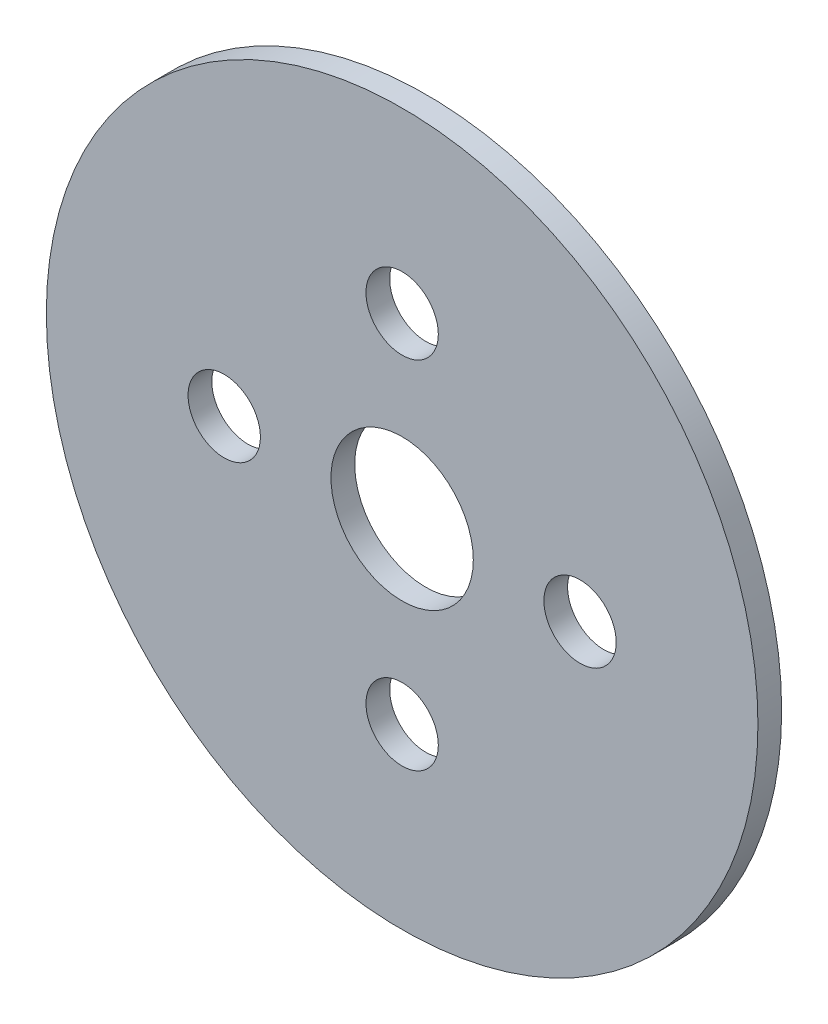
ISO-10303-21;
HEADER;
FILE_DESCRIPTION(('STEP AP214'),'2;1');
FILE_NAME('part.step','',(''),(''),'','','');
FILE_SCHEMA(('AUTOMOTIVE_DESIGN { 1 0 10303 214 1 1 1 1 }'));
ENDSEC;
DATA;
#1=APPLICATION_CONTEXT('core data for automotive mechanical design processes');
#2=APPLICATION_PROTOCOL_DEFINITION('international standard','automotive_design',2000,#1);
#3=PRODUCT_CONTEXT('',#1,'mechanical');
#4=PRODUCT('Part','Part','',(#3));
#5=PRODUCT_RELATED_PRODUCT_CATEGORY('part','',(#4));
#6=PRODUCT_DEFINITION_FORMATION('','',#4);
#7=PRODUCT_DEFINITION_CONTEXT('part definition',#1,'design');
#8=PRODUCT_DEFINITION('design','',#6,#7);
#9=PRODUCT_DEFINITION_SHAPE('','',#8);
#10=(LENGTH_UNIT() NAMED_UNIT(*) SI_UNIT(.MILLI.,.METRE.));
#11=(NAMED_UNIT(*) PLANE_ANGLE_UNIT() SI_UNIT($,.RADIAN.));
#12=(NAMED_UNIT(*) SI_UNIT($,.STERADIAN.) SOLID_ANGLE_UNIT());
#13=UNCERTAINTY_MEASURE_WITH_UNIT(LENGTH_MEASURE(1.E-05),#10,'distance_accuracy_value','');
#14=(GEOMETRIC_REPRESENTATION_CONTEXT(3) GLOBAL_UNCERTAINTY_ASSIGNED_CONTEXT((#13)) GLOBAL_UNIT_ASSIGNED_CONTEXT((#10,
#11,#12)) REPRESENTATION_CONTEXT('',''));
#15=CARTESIAN_POINT('',(0.,0.,0.));
#16=DIRECTION('',(0.,0.,1.));
#17=DIRECTION('',(1.,0.,0.));
#18=AXIS2_PLACEMENT_3D('',#15,#16,#17);
#19=CARTESIAN_POINT('',(0.,0.,1.));
#20=DIRECTION('',(0.,0.,1.));
#21=DIRECTION('',(1.,0.,0.));
#22=AXIS2_PLACEMENT_3D('',#19,#20,#21);
#23=PLANE('',#22);
#24=CARTESIAN_POINT('',(0.,0.,1.));
#25=DIRECTION('',(0.,0.,1.));
#26=DIRECTION('',(1.,0.,0.));
#27=AXIS2_PLACEMENT_3D('',#24,#25,#26);
#28=CIRCLE('',#27,3.);
#29=CARTESIAN_POINT('',(3.,0.,1.));
#30=VERTEX_POINT('',#29);
#31=EDGE_CURVE('E70',#30,#30,#28,.T.);
#32=ORIENTED_EDGE('',*,*,#31,.F.);
#33=EDGE_LOOP('',(#32));
#34=FACE_BOUND('',#33,.T.);
#35=CARTESIAN_POINT('',(0.,-7.5,1.));
#36=DIRECTION('',(0.,0.,1.));
#37=DIRECTION('',(1.,0.,0.));
#38=AXIS2_PLACEMENT_3D('',#35,#36,#37);
#39=CIRCLE('',#38,1.525);
#40=CARTESIAN_POINT('',(1.525,-7.5,1.));
#41=VERTEX_POINT('',#40);
#42=EDGE_CURVE('E55',#41,#41,#39,.T.);
#43=ORIENTED_EDGE('',*,*,#42,.F.);
#44=EDGE_LOOP('',(#43));
#45=FACE_BOUND('',#44,.T.);
#46=CARTESIAN_POINT('',(0.,7.5,1.));
#47=DIRECTION('',(0.,0.,1.));
#48=DIRECTION('',(1.,0.,0.));
#49=AXIS2_PLACEMENT_3D('',#46,#47,#48);
#50=CIRCLE('',#49,1.525);
#51=CARTESIAN_POINT('',(1.525,7.5,1.));
#52=VERTEX_POINT('',#51);
#53=EDGE_CURVE('E44',#52,#52,#50,.T.);
#54=ORIENTED_EDGE('',*,*,#53,.F.);
#55=EDGE_LOOP('',(#54));
#56=FACE_BOUND('',#55,.T.);
#57=CARTESIAN_POINT('',(0.,0.,1.));
#58=DIRECTION('',(0.,0.,1.));
#59=DIRECTION('',(1.,0.,0.));
#60=AXIS2_PLACEMENT_3D('',#57,#58,#59);
#61=CIRCLE('',#60,15.);
#62=CARTESIAN_POINT('',(15.,0.,1.));
#63=VERTEX_POINT('',#62);
#64=EDGE_CURVE('E10',#63,#63,#61,.T.);
#65=ORIENTED_EDGE('',*,*,#64,.T.);
#66=EDGE_LOOP('',(#65));
#67=FACE_BOUND('',#66,.T.);
#68=CARTESIAN_POINT('',(7.5,0.,1.));
#69=DIRECTION('',(0.,0.,1.));
#70=DIRECTION('',(1.,0.,0.));
#71=AXIS2_PLACEMENT_3D('',#68,#69,#70);
#72=CIRCLE('',#71,1.525);
#73=CARTESIAN_POINT('',(9.025,0.,1.));
#74=VERTEX_POINT('',#73);
#75=EDGE_CURVE('E49',#74,#74,#72,.T.);
#76=ORIENTED_EDGE('',*,*,#75,.F.);
#77=EDGE_LOOP('',(#76));
#78=FACE_BOUND('',#77,.T.);
#79=CARTESIAN_POINT('',(-7.5,0.,1.));
#80=DIRECTION('',(0.,0.,1.));
#81=DIRECTION('',(1.,0.,0.));
#82=AXIS2_PLACEMENT_3D('',#79,#80,#81);
#83=CIRCLE('',#82,1.525);
#84=CARTESIAN_POINT('',(-5.975,0.,1.));
#85=VERTEX_POINT('',#84);
#86=EDGE_CURVE('E61',#85,#85,#83,.T.);
#87=ORIENTED_EDGE('',*,*,#86,.F.);
#88=EDGE_LOOP('',(#87));
#89=FACE_BOUND('',#88,.T.);
#90=ADVANCED_FACE('F33',(#34,#45,#56,#67,#78,#89),#23,.T.);
#91=CARTESIAN_POINT('',(0.,0.,0.));
#92=DIRECTION('',(0.,0.,1.));
#93=DIRECTION('',(1.,0.,0.));
#94=AXIS2_PLACEMENT_3D('',#91,#92,#93);
#95=PLANE('',#94);
#96=CARTESIAN_POINT('',(0.,0.,0.));
#97=DIRECTION('',(0.,0.,1.));
#98=DIRECTION('',(1.,0.,0.));
#99=AXIS2_PLACEMENT_3D('',#96,#97,#98);
#100=CIRCLE('',#99,3.);
#101=CARTESIAN_POINT('',(3.,0.,0.));
#102=VERTEX_POINT('',#101);
#103=EDGE_CURVE('E67',#102,#102,#100,.T.);
#104=ORIENTED_EDGE('',*,*,#103,.T.);
#105=EDGE_LOOP('',(#104));
#106=FACE_BOUND('',#105,.T.);
#107=CARTESIAN_POINT('',(0.,0.,0.));
#108=DIRECTION('',(0.,0.,1.));
#109=DIRECTION('',(1.,0.,0.));
#110=AXIS2_PLACEMENT_3D('',#107,#108,#109);
#111=CIRCLE('',#110,15.);
#112=CARTESIAN_POINT('',(15.,0.,0.));
#113=VERTEX_POINT('',#112);
#114=EDGE_CURVE('E37',#113,#113,#111,.T.);
#115=ORIENTED_EDGE('',*,*,#114,.F.);
#116=EDGE_LOOP('',(#115));
#117=FACE_BOUND('',#116,.T.);
#118=CARTESIAN_POINT('',(0.,7.5,0.));
#119=DIRECTION('',(0.,0.,1.));
#120=DIRECTION('',(1.,0.,0.));
#121=AXIS2_PLACEMENT_3D('',#118,#119,#120);
#122=CIRCLE('',#121,1.525);
#123=CARTESIAN_POINT('',(1.525,7.5,0.));
#124=VERTEX_POINT('',#123);
#125=EDGE_CURVE('E46',#124,#124,#122,.T.);
#126=ORIENTED_EDGE('',*,*,#125,.T.);
#127=EDGE_LOOP('',(#126));
#128=FACE_BOUND('',#127,.T.);
#129=CARTESIAN_POINT('',(7.5,0.,0.));
#130=DIRECTION('',(0.,0.,1.));
#131=DIRECTION('',(1.,0.,0.));
#132=AXIS2_PLACEMENT_3D('',#129,#130,#131);
#133=CIRCLE('',#132,1.525);
#134=CARTESIAN_POINT('',(9.025,0.,0.));
#135=VERTEX_POINT('',#134);
#136=EDGE_CURVE('E52',#135,#135,#133,.T.);
#137=ORIENTED_EDGE('',*,*,#136,.T.);
#138=EDGE_LOOP('',(#137));
#139=FACE_BOUND('',#138,.T.);
#140=CARTESIAN_POINT('',(0.,-7.5,0.));
#141=DIRECTION('',(0.,0.,1.));
#142=DIRECTION('',(1.,0.,0.));
#143=AXIS2_PLACEMENT_3D('',#140,#141,#142);
#144=CIRCLE('',#143,1.525);
#145=CARTESIAN_POINT('',(1.525,-7.5,0.));
#146=VERTEX_POINT('',#145);
#147=EDGE_CURVE('E58',#146,#146,#144,.T.);
#148=ORIENTED_EDGE('',*,*,#147,.T.);
#149=EDGE_LOOP('',(#148));
#150=FACE_BOUND('',#149,.T.);
#151=CARTESIAN_POINT('',(-7.5,0.,0.));
#152=DIRECTION('',(0.,0.,1.));
#153=DIRECTION('',(1.,0.,0.));
#154=AXIS2_PLACEMENT_3D('',#151,#152,#153);
#155=CIRCLE('',#154,1.525);
#156=CARTESIAN_POINT('',(-5.975,0.,0.));
#157=VERTEX_POINT('',#156);
#158=EDGE_CURVE('E64',#157,#157,#155,.T.);
#159=ORIENTED_EDGE('',*,*,#158,.T.);
#160=EDGE_LOOP('',(#159));
#161=FACE_BOUND('',#160,.T.);
#162=ADVANCED_FACE('F76',(#106,#117,#128,#139,#150,#161),#95,.F.);
#163=CARTESIAN_POINT('',(0.,0.,1.));
#164=DIRECTION('',(0.,0.,-1.));
#165=DIRECTION('',(-1.,0.,0.));
#166=AXIS2_PLACEMENT_3D('',#163,#164,#165);
#167=CYLINDRICAL_SURFACE('',#166,15.);
#168=ORIENTED_EDGE('',*,*,#64,.F.);
#169=EDGE_LOOP('',(#168));
#170=FACE_BOUND('',#169,.T.);
#171=ORIENTED_EDGE('',*,*,#114,.T.);
#172=EDGE_LOOP('',(#171));
#173=FACE_BOUND('',#172,.T.);
#174=ADVANCED_FACE('F35',(#170,#173),#167,.T.);
#175=CARTESIAN_POINT('',(0.,7.5,1.));
#176=DIRECTION('',(0.,0.,-1.));
#177=DIRECTION('',(-1.,0.,0.));
#178=AXIS2_PLACEMENT_3D('',#175,#176,#177);
#179=CYLINDRICAL_SURFACE('',#178,1.525);
#180=ORIENTED_EDGE('',*,*,#53,.T.);
#181=EDGE_LOOP('',(#180));
#182=FACE_BOUND('',#181,.T.);
#183=ORIENTED_EDGE('',*,*,#125,.F.);
#184=EDGE_LOOP('',(#183));
#185=FACE_BOUND('',#184,.T.);
#186=ADVANCED_FACE('F107',(#182,#185),#179,.F.);
#187=CARTESIAN_POINT('',(7.5,0.,1.));
#188=DIRECTION('',(0.,0.,-1.));
#189=DIRECTION('',(-1.,0.,0.));
#190=AXIS2_PLACEMENT_3D('',#187,#188,#189);
#191=CYLINDRICAL_SURFACE('',#190,1.525);
#192=ORIENTED_EDGE('',*,*,#75,.T.);
#193=EDGE_LOOP('',(#192));
#194=FACE_BOUND('',#193,.T.);
#195=ORIENTED_EDGE('',*,*,#136,.F.);
#196=EDGE_LOOP('',(#195));
#197=FACE_BOUND('',#196,.T.);
#198=ADVANCED_FACE('F112',(#194,#197),#191,.F.);
#199=CARTESIAN_POINT('',(0.,-7.5,1.));
#200=DIRECTION('',(0.,0.,-1.));
#201=DIRECTION('',(-1.,0.,0.));
#202=AXIS2_PLACEMENT_3D('',#199,#200,#201);
#203=CYLINDRICAL_SURFACE('',#202,1.525);
#204=ORIENTED_EDGE('',*,*,#42,.T.);
#205=EDGE_LOOP('',(#204));
#206=FACE_BOUND('',#205,.T.);
#207=ORIENTED_EDGE('',*,*,#147,.F.);
#208=EDGE_LOOP('',(#207));
#209=FACE_BOUND('',#208,.T.);
#210=ADVANCED_FACE('F99',(#206,#209),#203,.F.);
#211=CARTESIAN_POINT('',(-7.5,0.,1.));
#212=DIRECTION('',(0.,0.,-1.));
#213=DIRECTION('',(-1.,0.,0.));
#214=AXIS2_PLACEMENT_3D('',#211,#212,#213);
#215=CYLINDRICAL_SURFACE('',#214,1.525);
#216=ORIENTED_EDGE('',*,*,#86,.T.);
#217=EDGE_LOOP('',(#216));
#218=FACE_BOUND('',#217,.T.);
#219=ORIENTED_EDGE('',*,*,#158,.F.);
#220=EDGE_LOOP('',(#219));
#221=FACE_BOUND('',#220,.T.);
#222=ADVANCED_FACE('F82',(#218,#221),#215,.F.);
#223=CARTESIAN_POINT('',(0.,0.,0.));
#224=DIRECTION('',(0.,0.,1.));
#225=DIRECTION('',(1.,0.,0.));
#226=AXIS2_PLACEMENT_3D('',#223,#224,#225);
#227=CYLINDRICAL_SURFACE('',#226,3.);
#228=ORIENTED_EDGE('',*,*,#103,.F.);
#229=EDGE_LOOP('',(#228));
#230=FACE_BOUND('',#229,.T.);
#231=ORIENTED_EDGE('',*,*,#31,.T.);
#232=EDGE_LOOP('',(#231));
#233=FACE_BOUND('',#232,.T.);
#234=ADVANCED_FACE('F79',(#230,#233),#227,.F.);
#235=CLOSED_SHELL('',(#90,#162,#174,#186,#198,#210,#222,#234));
#236=MANIFOLD_SOLID_BREP('B2',#235);
#237=ADVANCED_BREP_SHAPE_REPRESENTATION('',(#18,#236),#14);
#238=SHAPE_DEFINITION_REPRESENTATION(#9,#237);
ENDSEC;
END-ISO-10303-21;
